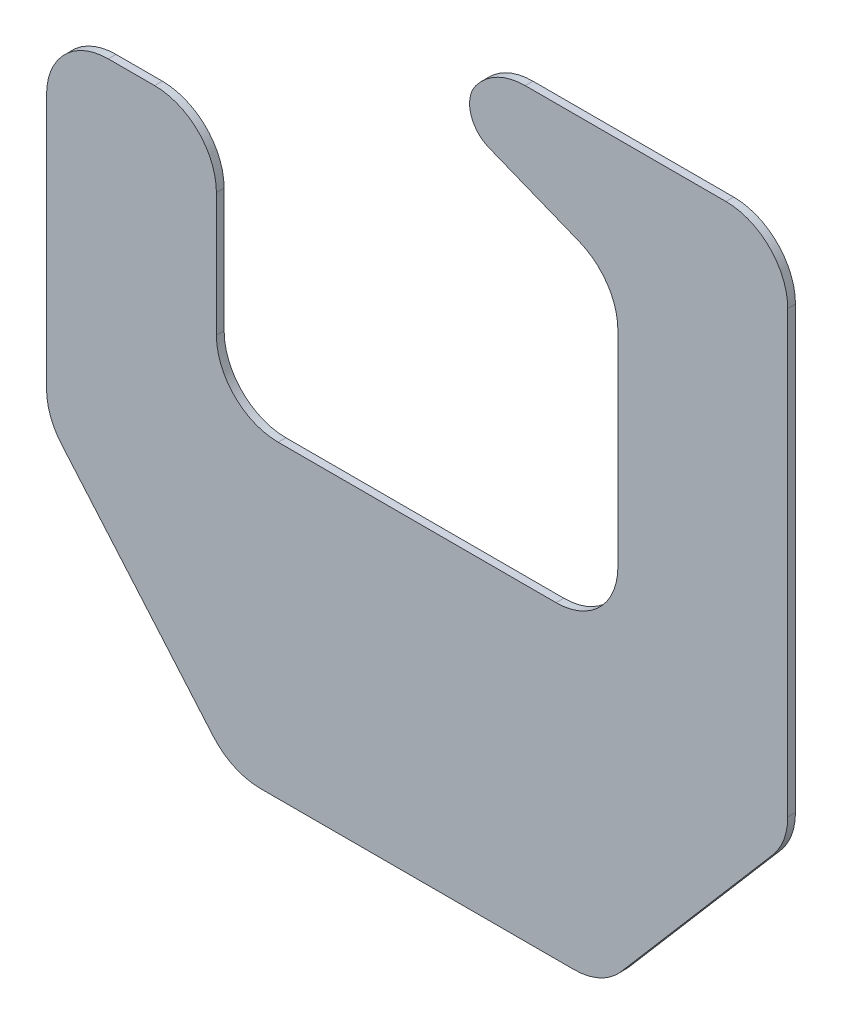
ISO-10303-21;
HEADER;
FILE_DESCRIPTION(('STEP AP214'),'2;1');
FILE_NAME('part.step','',(''),(''),'','','');
FILE_SCHEMA(('AUTOMOTIVE_DESIGN { 1 0 10303 214 1 1 1 1 }'));
ENDSEC;
DATA;
#1=APPLICATION_CONTEXT('core data for automotive mechanical design processes');
#2=APPLICATION_PROTOCOL_DEFINITION('international standard','automotive_design',2000,#1);
#3=PRODUCT_CONTEXT('',#1,'mechanical');
#4=PRODUCT('Part','Part','',(#3));
#5=PRODUCT_RELATED_PRODUCT_CATEGORY('part','',(#4));
#6=PRODUCT_DEFINITION_FORMATION('','',#4);
#7=PRODUCT_DEFINITION_CONTEXT('part definition',#1,'design');
#8=PRODUCT_DEFINITION('design','',#6,#7);
#9=PRODUCT_DEFINITION_SHAPE('','',#8);
#10=(LENGTH_UNIT() NAMED_UNIT(*) SI_UNIT(.MILLI.,.METRE.));
#11=(NAMED_UNIT(*) PLANE_ANGLE_UNIT() SI_UNIT($,.RADIAN.));
#12=(NAMED_UNIT(*) SI_UNIT($,.STERADIAN.) SOLID_ANGLE_UNIT());
#13=UNCERTAINTY_MEASURE_WITH_UNIT(LENGTH_MEASURE(1.E-05),#10,'distance_accuracy_value','');
#14=(GEOMETRIC_REPRESENTATION_CONTEXT(3) GLOBAL_UNCERTAINTY_ASSIGNED_CONTEXT((#13)) GLOBAL_UNIT_ASSIGNED_CONTEXT((#10,
#11,#12)) REPRESENTATION_CONTEXT('',''));
#15=CARTESIAN_POINT('',(0.,0.,0.));
#16=DIRECTION('',(0.,0.,1.));
#17=DIRECTION('',(1.,0.,0.));
#18=AXIS2_PLACEMENT_3D('',#15,#16,#17);
#19=CARTESIAN_POINT('',(0.,-129.032,64.516));
#20=DIRECTION('',(0.,0.,1.));
#21=DIRECTION('',(1.,0.,0.));
#22=AXIS2_PLACEMENT_3D('',#19,#20,#21);
#23=PLANE('',#22);
#24=DIRECTION('',(-0.650791373455968,-0.759256602365297,0.));
#25=VECTOR('',#24,1.);
#26=CARTESIAN_POINT('',(193.548,-516.128,64.516));
#27=LINE('',#26,#25);
#28=CARTESIAN_POINT('',(371.564198958199,-308.442434548767,64.516));
#29=VERTEX_POINT('',#28);
#30=CARTESIAN_POINT('',(212.859037500098,-493.598456249885,64.516));
#31=VERTEX_POINT('',#30);
#32=EDGE_CURVE('E172',#29,#31,#27,.T.);
#33=ORIENTED_EDGE('',*,*,#32,.T.);
#34=CARTESIAN_POINT('',(163.874838541899,-451.612,64.516));
#35=DIRECTION('',(0.,0.,1.));
#36=DIRECTION('',(1.,0.,0.));
#37=AXIS2_PLACEMENT_3D('',#34,#35,#36);
#38=CIRCLE('',#37,64.516);
#39=CARTESIAN_POINT('',(163.874838541899,-516.128,64.516));
#40=VERTEX_POINT('',#39);
#41=EDGE_CURVE('E186',#40,#31,#38,.T.);
#42=ORIENTED_EDGE('',*,*,#41,.F.);
#43=DIRECTION('',(1.,0.,0.));
#44=VECTOR('',#43,1.);
#45=CARTESIAN_POINT('',(-387.096,-516.128,64.516));
#46=LINE('',#45,#44);
#47=CARTESIAN_POINT('',(-163.874838541899,-516.128,64.516));
#48=VERTEX_POINT('',#47);
#49=EDGE_CURVE('E194',#48,#40,#46,.T.);
#50=ORIENTED_EDGE('',*,*,#49,.F.);
#51=CARTESIAN_POINT('',(-163.874838541899,-451.612,64.516));
#52=DIRECTION('',(0.,0.,-1.));
#53=DIRECTION('',(-1.,0.,0.));
#54=AXIS2_PLACEMENT_3D('',#51,#52,#53);
#55=CIRCLE('',#54,64.516);
#56=CARTESIAN_POINT('',(-212.859037500098,-493.598456249885,64.516));
#57=VERTEX_POINT('',#56);
#58=EDGE_CURVE('E274',#57,#48,#55,.F.);
#59=ORIENTED_EDGE('',*,*,#58,.F.);
#60=DIRECTION('',(-0.650791373455968,0.759256602365297,0.));
#61=VECTOR('',#60,1.);
#62=CARTESIAN_POINT('',(-387.096,-290.322,64.516));
#63=LINE('',#62,#61);
#64=CARTESIAN_POINT('',(-371.564198958199,-308.442434548767,64.516));
#65=VERTEX_POINT('',#64);
#66=EDGE_CURVE('E197',#57,#65,#63,.T.);
#67=ORIENTED_EDGE('',*,*,#66,.T.);
#68=CARTESIAN_POINT('',(-322.58,-266.455978298882,64.516));
#69=DIRECTION('',(0.,0.,1.));
#70=DIRECTION('',(1.,0.,0.));
#71=AXIS2_PLACEMENT_3D('',#68,#69,#70);
#72=CIRCLE('',#71,64.516);
#73=CARTESIAN_POINT('',(-387.096,-266.455978298882,64.516));
#74=VERTEX_POINT('',#73);
#75=EDGE_CURVE('E200',#74,#65,#72,.T.);
#76=ORIENTED_EDGE('',*,*,#75,.F.);
#77=DIRECTION('',(0.,1.,0.));
#78=VECTOR('',#77,1.);
#79=CARTESIAN_POINT('',(-387.096,258.064,64.516));
#80=LINE('',#79,#78);
#81=CARTESIAN_POINT('',(-387.096,-1.00630614952024E-13,64.516));
#82=VERTEX_POINT('',#81);
#83=EDGE_CURVE('E201',#82,#74,#80,.F.);
#84=ORIENTED_EDGE('',*,*,#83,.F.);
#85=CARTESIAN_POINT('',(-322.58,0.,64.516));
#86=DIRECTION('',(0.,0.,-1.));
#87=DIRECTION('',(-1.,0.,0.));
#88=AXIS2_PLACEMENT_3D('',#85,#86,#87);
#89=CIRCLE('',#88,64.516);
#90=CARTESIAN_POINT('',(-322.58,64.5159999999999,64.516));
#91=VERTEX_POINT('',#90);
#92=EDGE_CURVE('E279',#91,#82,#89,.F.);
#93=ORIENTED_EDGE('',*,*,#92,.F.);
#94=DIRECTION('',(1.,0.,0.));
#95=VECTOR('',#94,1.);
#96=CARTESIAN_POINT('',(-209.677,64.5159999999999,64.516));
#97=LINE('',#96,#95);
#98=CARTESIAN_POINT('',(-274.193,64.5159999999999,64.516));
#99=VERTEX_POINT('',#98);
#100=EDGE_CURVE('E205',#91,#99,#97,.T.);
#101=ORIENTED_EDGE('',*,*,#100,.T.);
#102=CARTESIAN_POINT('',(-274.193,0.,64.516));
#103=DIRECTION('',(0.,0.,-1.));
#104=DIRECTION('',(-1.,0.,0.));
#105=AXIS2_PLACEMENT_3D('',#102,#103,#104);
#106=CIRCLE('',#105,64.516);
#107=CARTESIAN_POINT('',(-209.677,0.,64.516));
#108=VERTEX_POINT('',#107);
#109=EDGE_CURVE('E282',#108,#99,#106,.F.);
#110=ORIENTED_EDGE('',*,*,#109,.F.);
#111=DIRECTION('',(0.,1.,0.));
#112=VECTOR('',#111,1.);
#113=CARTESIAN_POINT('',(-209.677,-193.548,64.516));
#114=LINE('',#113,#112);
#115=CARTESIAN_POINT('',(-209.677,-129.032,64.516));
#116=VERTEX_POINT('',#115);
#117=EDGE_CURVE('E209',#108,#116,#114,.F.);
#118=ORIENTED_EDGE('',*,*,#117,.T.);
#119=CARTESIAN_POINT('',(-145.161,-129.032,64.516));
#120=DIRECTION('',(0.,0.,-1.));
#121=DIRECTION('',(-1.,0.,0.));
#122=AXIS2_PLACEMENT_3D('',#119,#120,#121);
#123=CIRCLE('',#122,64.516);
#124=CARTESIAN_POINT('',(-145.161,-193.548,64.516));
#125=VERTEX_POINT('',#124);
#126=EDGE_CURVE('E212',#125,#116,#123,.T.);
#127=ORIENTED_EDGE('',*,*,#126,.F.);
#128=DIRECTION('',(1.,0.,0.));
#129=VECTOR('',#128,1.);
#130=CARTESIAN_POINT('',(209.677,-193.548,64.516));
#131=LINE('',#130,#129);
#132=CARTESIAN_POINT('',(145.161,-193.548,64.516));
#133=VERTEX_POINT('',#132);
#134=EDGE_CURVE('E213',#125,#133,#131,.T.);
#135=ORIENTED_EDGE('',*,*,#134,.T.);
#136=CARTESIAN_POINT('',(145.161,-129.032,64.516));
#137=DIRECTION('',(0.,0.,-1.));
#138=DIRECTION('',(-1.,0.,0.));
#139=AXIS2_PLACEMENT_3D('',#136,#137,#138);
#140=CIRCLE('',#139,64.516);
#141=CARTESIAN_POINT('',(209.677,-129.032,64.516));
#142=VERTEX_POINT('',#141);
#143=EDGE_CURVE('E216',#142,#133,#140,.T.);
#144=ORIENTED_EDGE('',*,*,#143,.F.);
#145=DIRECTION('',(0.,1.,0.));
#146=VECTOR('',#145,1.);
#147=CARTESIAN_POINT('',(209.677,129.032,64.516));
#148=LINE('',#147,#146);
#149=CARTESIAN_POINT('',(209.677,85.3525414605821,64.516));
#150=VERTEX_POINT('',#149);
#151=EDGE_CURVE('E217',#142,#150,#148,.T.);
#152=ORIENTED_EDGE('',*,*,#151,.T.);
#153=CARTESIAN_POINT('',(145.161,85.3525414605821,64.516));
#154=DIRECTION('',(0.,0.,-1.));
#155=DIRECTION('',(-1.,0.,0.));
#156=AXIS2_PLACEMENT_3D('',#153,#154,#155);
#157=CIRCLE('',#156,64.516);
#158=CARTESIAN_POINT('',(169.121640875661,145.254143649735,64.516));
#159=VERTEX_POINT('',#158);
#160=EDGE_CURVE('E220',#159,#150,#157,.T.);
#161=ORIENTED_EDGE('',*,*,#160,.F.);
#162=DIRECTION('',(-0.928476690885259,0.371390676354104,0.));
#163=VECTOR('',#162,1.);
#164=CARTESIAN_POINT('',(48.387,193.548,64.516));
#165=LINE('',#164,#163);
#166=CARTESIAN_POINT('',(75.061187964,182.8783248144,64.516));
#167=VERTEX_POINT('',#166);
#168=EDGE_CURVE('E221',#159,#167,#165,.T.);
#169=ORIENTED_EDGE('',*,*,#168,.T.);
#170=CARTESIAN_POINT('',(87.0415084018307,212.829125908977,64.516));
#171=DIRECTION('',(0.,0.,-1.));
#172=DIRECTION('',(-1.,0.,0.));
#173=AXIS2_PLACEMENT_3D('',#170,#171,#172);
#174=CIRCLE('',#173,32.258);
#175=CARTESIAN_POINT('',(61.1800168036613,232.110251817953,64.516));
#176=VERTEX_POINT('',#175);
#177=EDGE_CURVE('E294',#176,#167,#174,.F.);
#178=ORIENTED_EDGE('',*,*,#177,.F.);
#179=CARTESIAN_POINT('',(112.903,193.548,64.516));
#180=DIRECTION('',(0.,0.,1.));
#181=DIRECTION('',(1.,0.,0.));
#182=AXIS2_PLACEMENT_3D('',#179,#180,#181);
#183=CIRCLE('',#182,64.516);
#184=CARTESIAN_POINT('',(112.903,258.064,64.516));
#185=VERTEX_POINT('',#184);
#186=EDGE_CURVE('E297',#185,#176,#183,.T.);
#187=ORIENTED_EDGE('',*,*,#186,.F.);
#188=DIRECTION('',(1.,0.,0.));
#189=VECTOR('',#188,1.);
#190=CARTESIAN_POINT('',(387.096,258.064,64.516));
#191=LINE('',#190,#189);
#192=CARTESIAN_POINT('',(322.58,258.064,64.516));
#193=VERTEX_POINT('',#192);
#194=EDGE_CURVE('E225',#193,#185,#191,.F.);
#195=ORIENTED_EDGE('',*,*,#194,.F.);
#196=CARTESIAN_POINT('',(322.58,193.548,64.516));
#197=DIRECTION('',(0.,0.,1.));
#198=DIRECTION('',(1.,0.,0.));
#199=AXIS2_PLACEMENT_3D('',#196,#197,#198);
#200=CIRCLE('',#199,64.516);
#201=CARTESIAN_POINT('',(387.096,193.548,64.516));
#202=VERTEX_POINT('',#201);
#203=EDGE_CURVE('E299',#202,#193,#200,.T.);
#204=ORIENTED_EDGE('',*,*,#203,.F.);
#205=DIRECTION('',(0.,1.,0.));
#206=VECTOR('',#205,1.);
#207=CARTESIAN_POINT('',(387.096,-516.128,64.516));
#208=LINE('',#207,#206);
#209=CARTESIAN_POINT('',(387.096,-266.455978298882,64.516));
#210=VERTEX_POINT('',#209);
#211=EDGE_CURVE('E174',#210,#202,#208,.T.);
#212=ORIENTED_EDGE('',*,*,#211,.F.);
#213=CARTESIAN_POINT('',(322.58,-266.455978298882,64.516));
#214=DIRECTION('',(0.,0.,-1.));
#215=DIRECTION('',(-1.,0.,0.));
#216=AXIS2_PLACEMENT_3D('',#213,#214,#215);
#217=CIRCLE('',#216,64.516);
#218=EDGE_CURVE('E19',#29,#210,#217,.F.);
#219=ORIENTED_EDGE('',*,*,#218,.F.);
#220=EDGE_LOOP('',(#33,#42,#50,#59,#67,#76,#84,#93,#101,#110,#118,#127,#135,#144,#152,#161,#169,
#178,#187,#195,#204,#212,#219));
#221=FACE_BOUND('',#220,.T.);
#222=ADVANCED_FACE('F16',(#221),#23,.F.);
#223=CARTESIAN_POINT('',(322.58,-266.455978298882,68.54825));
#224=DIRECTION('',(0.,0.,-1.));
#225=DIRECTION('',(-1.,0.,0.));
#226=AXIS2_PLACEMENT_3D('',#223,#224,#225);
#227=CYLINDRICAL_SURFACE('',#226,64.516);
#228=CARTESIAN_POINT('',(322.58,-266.455978298882,72.5805));
#229=DIRECTION('',(0.,0.,-1.));
#230=DIRECTION('',(-1.,0.,0.));
#231=AXIS2_PLACEMENT_3D('',#228,#229,#230);
#232=CIRCLE('',#231,64.516);
#233=CARTESIAN_POINT('',(371.564198958199,-308.442434548767,72.5805));
#234=VERTEX_POINT('',#233);
#235=CARTESIAN_POINT('',(387.096,-266.455978298882,72.5805));
#236=VERTEX_POINT('',#235);
#237=EDGE_CURVE('E182',#234,#236,#232,.F.);
#238=ORIENTED_EDGE('',*,*,#237,.F.);
#239=DIRECTION('',(0.,0.,1.));
#240=VECTOR('',#239,1.);
#241=CARTESIAN_POINT('',(371.564198958199,-308.442434548767,72.5805));
#242=LINE('',#241,#240);
#243=EDGE_CURVE('E179',#234,#29,#242,.F.);
#244=ORIENTED_EDGE('',*,*,#243,.T.);
#245=ORIENTED_EDGE('',*,*,#218,.T.);
#246=DIRECTION('',(0.,0.,-1.));
#247=VECTOR('',#246,1.);
#248=CARTESIAN_POINT('',(387.096,-266.455978298882,64.516));
#249=LINE('',#248,#247);
#250=EDGE_CURVE('E177',#236,#210,#249,.T.);
#251=ORIENTED_EDGE('',*,*,#250,.F.);
#252=EDGE_LOOP('',(#238,#244,#245,#251));
#253=FACE_BOUND('',#252,.T.);
#254=ADVANCED_FACE('F180',(#253),#227,.T.);
#255=CARTESIAN_POINT('',(387.096,-516.128,64.516));
#256=DIRECTION('',(1.,0.,0.));
#257=DIRECTION('',(0.,0.,-1.));
#258=AXIS2_PLACEMENT_3D('',#255,#256,#257);
#259=PLANE('',#258);
#260=DIRECTION('',(0.,0.,1.));
#261=VECTOR('',#260,1.);
#262=CARTESIAN_POINT('',(387.096,193.548,64.516));
#263=LINE('',#262,#261);
#264=CARTESIAN_POINT('',(387.096,193.548,72.5805));
#265=VERTEX_POINT('',#264);
#266=EDGE_CURVE('E230',#265,#202,#263,.F.);
#267=ORIENTED_EDGE('',*,*,#266,.F.);
#268=DIRECTION('',(0.,1.,0.));
#269=VECTOR('',#268,1.);
#270=CARTESIAN_POINT('',(387.096,-129.032,72.5805));
#271=LINE('',#270,#269);
#272=EDGE_CURVE('E272',#236,#265,#271,.T.);
#273=ORIENTED_EDGE('',*,*,#272,.F.);
#274=ORIENTED_EDGE('',*,*,#250,.T.);
#275=ORIENTED_EDGE('',*,*,#211,.T.);
#276=EDGE_LOOP('',(#267,#273,#274,#275));
#277=FACE_BOUND('',#276,.T.);
#278=ADVANCED_FACE('F576',(#277),#259,.T.);
#279=CARTESIAN_POINT('',(322.58,193.548,64.516));
#280=DIRECTION('',(0.,0.,1.));
#281=DIRECTION('',(1.,0.,0.));
#282=AXIS2_PLACEMENT_3D('',#279,#280,#281);
#283=CYLINDRICAL_SURFACE('',#282,64.516);
#284=ORIENTED_EDGE('',*,*,#203,.T.);
#285=DIRECTION('',(0.,0.,1.));
#286=VECTOR('',#285,1.);
#287=CARTESIAN_POINT('',(322.58,258.064,64.516));
#288=LINE('',#287,#286);
#289=CARTESIAN_POINT('',(322.58,258.064,72.5805));
#290=VERTEX_POINT('',#289);
#291=EDGE_CURVE('E228',#290,#193,#288,.F.);
#292=ORIENTED_EDGE('',*,*,#291,.F.);
#293=CARTESIAN_POINT('',(322.58,193.548,72.5805));
#294=DIRECTION('',(0.,0.,1.));
#295=DIRECTION('',(1.,0.,0.));
#296=AXIS2_PLACEMENT_3D('',#293,#294,#295);
#297=CIRCLE('',#296,64.516);
#298=EDGE_CURVE('E269',#265,#290,#297,.T.);
#299=ORIENTED_EDGE('',*,*,#298,.F.);
#300=ORIENTED_EDGE('',*,*,#266,.T.);
#301=EDGE_LOOP('',(#284,#292,#299,#300));
#302=FACE_BOUND('',#301,.T.);
#303=ADVANCED_FACE('F566',(#302),#283,.T.);
#304=CARTESIAN_POINT('',(387.096,258.064,64.516));
#305=DIRECTION('',(0.,1.,0.));
#306=DIRECTION('',(0.,0.,1.));
#307=AXIS2_PLACEMENT_3D('',#304,#305,#306);
#308=PLANE('',#307);
#309=DIRECTION('',(0.,0.,1.));
#310=VECTOR('',#309,1.);
#311=CARTESIAN_POINT('',(112.903,258.064,68.54825));
#312=LINE('',#311,#310);
#313=CARTESIAN_POINT('',(112.903,258.064,72.5805));
#314=VERTEX_POINT('',#313);
#315=EDGE_CURVE('E227',#314,#185,#312,.F.);
#316=ORIENTED_EDGE('',*,*,#315,.F.);
#317=DIRECTION('',(1.,0.,0.));
#318=VECTOR('',#317,1.);
#319=CARTESIAN_POINT('',(0.,258.064,72.5805));
#320=LINE('',#319,#318);
#321=EDGE_CURVE('E268',#290,#314,#320,.F.);
#322=ORIENTED_EDGE('',*,*,#321,.F.);
#323=ORIENTED_EDGE('',*,*,#291,.T.);
#324=ORIENTED_EDGE('',*,*,#194,.T.);
#325=EDGE_LOOP('',(#316,#322,#323,#324));
#326=FACE_BOUND('',#325,.T.);
#327=ADVANCED_FACE('F556',(#326),#308,.T.);
#328=CARTESIAN_POINT('',(112.903,193.548,68.54825));
#329=DIRECTION('',(0.,0.,1.));
#330=DIRECTION('',(1.,0.,0.));
#331=AXIS2_PLACEMENT_3D('',#328,#329,#330);
#332=CYLINDRICAL_SURFACE('',#331,64.516);
#333=ORIENTED_EDGE('',*,*,#315,.T.);
#334=ORIENTED_EDGE('',*,*,#186,.T.);
#335=DIRECTION('',(0.,0.,-1.));
#336=VECTOR('',#335,1.);
#337=CARTESIAN_POINT('',(61.1800168036613,232.110251817953,68.54825));
#338=LINE('',#337,#336);
#339=CARTESIAN_POINT('',(61.1800168036613,232.110251817953,72.5805));
#340=VERTEX_POINT('',#339);
#341=EDGE_CURVE('E224',#340,#176,#338,.T.);
#342=ORIENTED_EDGE('',*,*,#341,.F.);
#343=CARTESIAN_POINT('',(112.903,193.548,72.5805));
#344=DIRECTION('',(0.,0.,1.));
#345=DIRECTION('',(1.,0.,0.));
#346=AXIS2_PLACEMENT_3D('',#343,#344,#345);
#347=CIRCLE('',#346,64.516);
#348=EDGE_CURVE('E265',#314,#340,#347,.T.);
#349=ORIENTED_EDGE('',*,*,#348,.F.);
#350=EDGE_LOOP('',(#333,#334,#342,#349));
#351=FACE_BOUND('',#350,.T.);
#352=ADVANCED_FACE('F546',(#351),#332,.T.);
#353=CARTESIAN_POINT('',(87.0415084018307,212.829125908977,68.54825));
#354=DIRECTION('',(0.,0.,-1.));
#355=DIRECTION('',(-1.,0.,0.));
#356=AXIS2_PLACEMENT_3D('',#353,#354,#355);
#357=CYLINDRICAL_SURFACE('',#356,32.258);
#358=CARTESIAN_POINT('',(87.0415084018307,212.829125908977,72.5805));
#359=DIRECTION('',(0.,0.,-1.));
#360=DIRECTION('',(-1.,0.,0.));
#361=AXIS2_PLACEMENT_3D('',#358,#359,#360);
#362=CIRCLE('',#361,32.258);
#363=CARTESIAN_POINT('',(75.061187964,182.8783248144,72.5805));
#364=VERTEX_POINT('',#363);
#365=EDGE_CURVE('E262',#340,#364,#362,.F.);
#366=ORIENTED_EDGE('',*,*,#365,.F.);
#367=ORIENTED_EDGE('',*,*,#341,.T.);
#368=ORIENTED_EDGE('',*,*,#177,.T.);
#369=DIRECTION('',(0.,0.,1.));
#370=VECTOR('',#369,1.);
#371=CARTESIAN_POINT('',(75.061187964,182.8783248144,72.5805));
#372=LINE('',#371,#370);
#373=EDGE_CURVE('E223',#167,#364,#372,.T.);
#374=ORIENTED_EDGE('',*,*,#373,.T.);
#375=EDGE_LOOP('',(#366,#367,#368,#374));
#376=FACE_BOUND('',#375,.T.);
#377=ADVANCED_FACE('F536',(#376),#357,.T.);
#378=CARTESIAN_POINT('',(48.387,193.548,72.5805));
#379=DIRECTION('',(0.371390676354104,0.928476690885259,0.));
#380=DIRECTION('',(-0.928476690885259,0.371390676354104,0.));
#381=AXIS2_PLACEMENT_3D('',#378,#379,#380);
#382=PLANE('',#381);
#383=DIRECTION('',(0.928476690885259,-0.371390676354104,0.));
#384=VECTOR('',#383,1.);
#385=CARTESIAN_POINT('',(75.061187964,182.8783248144,72.5805));
#386=LINE('',#385,#384);
#387=CARTESIAN_POINT('',(169.121640875661,145.254143649735,72.5805));
#388=VERTEX_POINT('',#387);
#389=EDGE_CURVE('E261',#364,#388,#386,.T.);
#390=ORIENTED_EDGE('',*,*,#389,.F.);
#391=ORIENTED_EDGE('',*,*,#373,.F.);
#392=ORIENTED_EDGE('',*,*,#168,.F.);
#393=DIRECTION('',(0.,0.,-1.));
#394=VECTOR('',#393,1.);
#395=CARTESIAN_POINT('',(169.121640875661,145.254143649735,72.5805));
#396=LINE('',#395,#394);
#397=EDGE_CURVE('E293',#388,#159,#396,.T.);
#398=ORIENTED_EDGE('',*,*,#397,.F.);
#399=EDGE_LOOP('',(#390,#391,#392,#398));
#400=FACE_BOUND('',#399,.T.);
#401=ADVANCED_FACE('F526',(#400),#382,.F.);
#402=CARTESIAN_POINT('',(145.161,85.3525414605821,72.5805));
#403=DIRECTION('',(0.,0.,-1.));
#404=DIRECTION('',(-1.,0.,0.));
#405=AXIS2_PLACEMENT_3D('',#402,#403,#404);
#406=CYLINDRICAL_SURFACE('',#405,64.516);
#407=ORIENTED_EDGE('',*,*,#160,.T.);
#408=DIRECTION('',(0.,0.,-1.));
#409=VECTOR('',#408,1.);
#410=CARTESIAN_POINT('',(209.677,85.3525414605821,72.5805));
#411=LINE('',#410,#409);
#412=CARTESIAN_POINT('',(209.677,85.3525414605821,72.5805));
#413=VERTEX_POINT('',#412);
#414=EDGE_CURVE('E219',#150,#413,#411,.F.);
#415=ORIENTED_EDGE('',*,*,#414,.T.);
#416=CARTESIAN_POINT('',(145.161,85.3525414605821,72.5805));
#417=DIRECTION('',(0.,0.,-1.));
#418=DIRECTION('',(-1.,0.,0.));
#419=AXIS2_PLACEMENT_3D('',#416,#417,#418);
#420=CIRCLE('',#419,64.516);
#421=EDGE_CURVE('E258',#388,#413,#420,.T.);
#422=ORIENTED_EDGE('',*,*,#421,.F.);
#423=ORIENTED_EDGE('',*,*,#397,.T.);
#424=EDGE_LOOP('',(#407,#415,#422,#423));
#425=FACE_BOUND('',#424,.T.);
#426=ADVANCED_FACE('F516',(#425),#406,.F.);
#427=CARTESIAN_POINT('',(209.677,129.032,72.5805));
#428=DIRECTION('',(1.,0.,0.));
#429=DIRECTION('',(0.,0.,-1.));
#430=AXIS2_PLACEMENT_3D('',#427,#428,#429);
#431=PLANE('',#430);
#432=ORIENTED_EDGE('',*,*,#151,.F.);
#433=DIRECTION('',(0.,0.,-1.));
#434=VECTOR('',#433,1.);
#435=CARTESIAN_POINT('',(209.677,-129.032,72.5805));
#436=LINE('',#435,#434);
#437=CARTESIAN_POINT('',(209.677,-129.032,72.5805));
#438=VERTEX_POINT('',#437);
#439=EDGE_CURVE('E290',#438,#142,#436,.T.);
#440=ORIENTED_EDGE('',*,*,#439,.F.);
#441=DIRECTION('',(0.,1.,0.));
#442=VECTOR('',#441,1.);
#443=CARTESIAN_POINT('',(209.677,-129.032,72.5805));
#444=LINE('',#443,#442);
#445=EDGE_CURVE('E257',#413,#438,#444,.F.);
#446=ORIENTED_EDGE('',*,*,#445,.F.);
#447=ORIENTED_EDGE('',*,*,#414,.F.);
#448=EDGE_LOOP('',(#432,#440,#446,#447));
#449=FACE_BOUND('',#448,.T.);
#450=ADVANCED_FACE('F506',(#449),#431,.F.);
#451=CARTESIAN_POINT('',(145.161,-129.032,72.5805));
#452=DIRECTION('',(0.,0.,-1.));
#453=DIRECTION('',(-1.,0.,0.));
#454=AXIS2_PLACEMENT_3D('',#451,#452,#453);
#455=CYLINDRICAL_SURFACE('',#454,64.516);
#456=ORIENTED_EDGE('',*,*,#143,.T.);
#457=DIRECTION('',(0.,0.,-1.));
#458=VECTOR('',#457,1.);
#459=CARTESIAN_POINT('',(145.161,-193.548,72.5805));
#460=LINE('',#459,#458);
#461=CARTESIAN_POINT('',(145.161,-193.548,72.5805));
#462=VERTEX_POINT('',#461);
#463=EDGE_CURVE('E215',#133,#462,#460,.F.);
#464=ORIENTED_EDGE('',*,*,#463,.T.);
#465=CARTESIAN_POINT('',(145.161,-129.032,72.5805));
#466=DIRECTION('',(0.,0.,-1.));
#467=DIRECTION('',(-1.,0.,0.));
#468=AXIS2_PLACEMENT_3D('',#465,#466,#467);
#469=CIRCLE('',#468,64.516);
#470=EDGE_CURVE('E254',#438,#462,#469,.T.);
#471=ORIENTED_EDGE('',*,*,#470,.F.);
#472=ORIENTED_EDGE('',*,*,#439,.T.);
#473=EDGE_LOOP('',(#456,#464,#471,#472));
#474=FACE_BOUND('',#473,.T.);
#475=ADVANCED_FACE('F496',(#474),#455,.F.);
#476=CARTESIAN_POINT('',(209.677,-193.548,72.5805));
#477=DIRECTION('',(0.,-1.,0.));
#478=DIRECTION('',(0.,0.,-1.));
#479=AXIS2_PLACEMENT_3D('',#476,#477,#478);
#480=PLANE('',#479);
#481=DIRECTION('',(1.,0.,0.));
#482=VECTOR('',#481,1.);
#483=CARTESIAN_POINT('',(0.,-193.548,72.5805));
#484=LINE('',#483,#482);
#485=CARTESIAN_POINT('',(-145.161,-193.548,72.5805));
#486=VERTEX_POINT('',#485);
#487=EDGE_CURVE('E253',#462,#486,#484,.F.);
#488=ORIENTED_EDGE('',*,*,#487,.F.);
#489=ORIENTED_EDGE('',*,*,#463,.F.);
#490=ORIENTED_EDGE('',*,*,#134,.F.);
#491=DIRECTION('',(0.,0.,-1.));
#492=VECTOR('',#491,1.);
#493=CARTESIAN_POINT('',(-145.161,-193.548,72.5805));
#494=LINE('',#493,#492);
#495=EDGE_CURVE('E287',#486,#125,#494,.T.);
#496=ORIENTED_EDGE('',*,*,#495,.F.);
#497=EDGE_LOOP('',(#488,#489,#490,#496));
#498=FACE_BOUND('',#497,.T.);
#499=ADVANCED_FACE('F486',(#498),#480,.F.);
#500=CARTESIAN_POINT('',(-145.161,-129.032,72.5805));
#501=DIRECTION('',(0.,0.,-1.));
#502=DIRECTION('',(-1.,0.,0.));
#503=AXIS2_PLACEMENT_3D('',#500,#501,#502);
#504=CYLINDRICAL_SURFACE('',#503,64.516);
#505=ORIENTED_EDGE('',*,*,#126,.T.);
#506=DIRECTION('',(0.,0.,1.));
#507=VECTOR('',#506,1.);
#508=CARTESIAN_POINT('',(-209.677,-129.032,72.5805));
#509=LINE('',#508,#507);
#510=CARTESIAN_POINT('',(-209.677,-129.032,72.5805));
#511=VERTEX_POINT('',#510);
#512=EDGE_CURVE('E211',#116,#511,#509,.T.);
#513=ORIENTED_EDGE('',*,*,#512,.T.);
#514=CARTESIAN_POINT('',(-145.161,-129.032,72.5805));
#515=DIRECTION('',(0.,0.,-1.));
#516=DIRECTION('',(-1.,0.,0.));
#517=AXIS2_PLACEMENT_3D('',#514,#515,#516);
#518=CIRCLE('',#517,64.516);
#519=EDGE_CURVE('E250',#486,#511,#518,.T.);
#520=ORIENTED_EDGE('',*,*,#519,.F.);
#521=ORIENTED_EDGE('',*,*,#495,.T.);
#522=EDGE_LOOP('',(#505,#513,#520,#521));
#523=FACE_BOUND('',#522,.T.);
#524=ADVANCED_FACE('F476',(#523),#504,.F.);
#525=CARTESIAN_POINT('',(-209.677,-193.548,72.5805));
#526=DIRECTION('',(-1.,0.,0.));
#527=DIRECTION('',(0.,0.,1.));
#528=AXIS2_PLACEMENT_3D('',#525,#526,#527);
#529=PLANE('',#528);
#530=DIRECTION('',(0.,1.,0.));
#531=VECTOR('',#530,1.);
#532=CARTESIAN_POINT('',(-209.677,-129.032,72.5805));
#533=LINE('',#532,#531);
#534=CARTESIAN_POINT('',(-209.677,0.,72.5805));
#535=VERTEX_POINT('',#534);
#536=EDGE_CURVE('E249',#511,#535,#533,.T.);
#537=ORIENTED_EDGE('',*,*,#536,.F.);
#538=ORIENTED_EDGE('',*,*,#512,.F.);
#539=ORIENTED_EDGE('',*,*,#117,.F.);
#540=DIRECTION('',(0.,0.,-1.));
#541=VECTOR('',#540,1.);
#542=CARTESIAN_POINT('',(-209.677,0.,72.5805));
#543=LINE('',#542,#541);
#544=EDGE_CURVE('E208',#535,#108,#543,.T.);
#545=ORIENTED_EDGE('',*,*,#544,.F.);
#546=EDGE_LOOP('',(#537,#538,#539,#545));
#547=FACE_BOUND('',#546,.T.);
#548=ADVANCED_FACE('F466',(#547),#529,.F.);
#549=CARTESIAN_POINT('',(-274.193,0.,72.5805));
#550=DIRECTION('',(0.,0.,-1.));
#551=DIRECTION('',(-1.,0.,0.));
#552=AXIS2_PLACEMENT_3D('',#549,#550,#551);
#553=CYLINDRICAL_SURFACE('',#552,64.516);
#554=CARTESIAN_POINT('',(-274.193,0.,72.5805));
#555=DIRECTION('',(0.,0.,-1.));
#556=DIRECTION('',(-1.,0.,0.));
#557=AXIS2_PLACEMENT_3D('',#554,#555,#556);
#558=CIRCLE('',#557,64.516);
#559=CARTESIAN_POINT('',(-274.193,64.5159999999999,72.5805));
#560=VERTEX_POINT('',#559);
#561=EDGE_CURVE('E246',#535,#560,#558,.F.);
#562=ORIENTED_EDGE('',*,*,#561,.F.);
#563=ORIENTED_EDGE('',*,*,#544,.T.);
#564=ORIENTED_EDGE('',*,*,#109,.T.);
#565=DIRECTION('',(0.,0.,-1.));
#566=VECTOR('',#565,1.);
#567=CARTESIAN_POINT('',(-274.193,64.5159999999999,72.5805));
#568=LINE('',#567,#566);
#569=EDGE_CURVE('E207',#99,#560,#568,.F.);
#570=ORIENTED_EDGE('',*,*,#569,.T.);
#571=EDGE_LOOP('',(#562,#563,#564,#570));
#572=FACE_BOUND('',#571,.T.);
#573=ADVANCED_FACE('F456',(#572),#553,.T.);
#574=CARTESIAN_POINT('',(-209.677,64.5159999999999,72.5805));
#575=DIRECTION('',(0.,-1.,0.));
#576=DIRECTION('',(0.,0.,-1.));
#577=AXIS2_PLACEMENT_3D('',#574,#575,#576);
#578=PLANE('',#577);
#579=DIRECTION('',(1.,0.,0.));
#580=VECTOR('',#579,1.);
#581=CARTESIAN_POINT('',(0.,64.5159999999999,72.5805));
#582=LINE('',#581,#580);
#583=CARTESIAN_POINT('',(-322.58,64.5159999999999,72.5805));
#584=VERTEX_POINT('',#583);
#585=EDGE_CURVE('E245',#560,#584,#582,.F.);
#586=ORIENTED_EDGE('',*,*,#585,.F.);
#587=ORIENTED_EDGE('',*,*,#569,.F.);
#588=ORIENTED_EDGE('',*,*,#100,.F.);
#589=DIRECTION('',(0.,0.,-1.));
#590=VECTOR('',#589,1.);
#591=CARTESIAN_POINT('',(-322.58,64.5159999999999,68.54825));
#592=LINE('',#591,#590);
#593=EDGE_CURVE('E281',#584,#91,#592,.T.);
#594=ORIENTED_EDGE('',*,*,#593,.F.);
#595=EDGE_LOOP('',(#586,#587,#588,#594));
#596=FACE_BOUND('',#595,.T.);
#597=ADVANCED_FACE('F446',(#596),#578,.F.);
#598=CARTESIAN_POINT('',(-322.58,0.,68.54825));
#599=DIRECTION('',(0.,0.,-1.));
#600=DIRECTION('',(-1.,0.,0.));
#601=AXIS2_PLACEMENT_3D('',#598,#599,#600);
#602=CYLINDRICAL_SURFACE('',#601,64.516);
#603=CARTESIAN_POINT('',(-322.58,0.,72.5805));
#604=DIRECTION('',(0.,0.,-1.));
#605=DIRECTION('',(-1.,0.,0.));
#606=AXIS2_PLACEMENT_3D('',#603,#604,#605);
#607=CIRCLE('',#606,64.516);
#608=CARTESIAN_POINT('',(-387.096,-1.00630614952024E-13,72.5805));
#609=VERTEX_POINT('',#608);
#610=EDGE_CURVE('E242',#584,#609,#607,.F.);
#611=ORIENTED_EDGE('',*,*,#610,.F.);
#612=ORIENTED_EDGE('',*,*,#593,.T.);
#613=ORIENTED_EDGE('',*,*,#92,.T.);
#614=DIRECTION('',(0.,0.,1.));
#615=VECTOR('',#614,1.);
#616=CARTESIAN_POINT('',(-387.096,-1.11022302462516E-13,64.516));
#617=LINE('',#616,#615);
#618=EDGE_CURVE('E204',#609,#82,#617,.F.);
#619=ORIENTED_EDGE('',*,*,#618,.F.);
#620=EDGE_LOOP('',(#611,#612,#613,#619));
#621=FACE_BOUND('',#620,.T.);
#622=ADVANCED_FACE('F436',(#621),#602,.T.);
#623=CARTESIAN_POINT('',(-387.096,258.064,64.516));
#624=DIRECTION('',(-1.,0.,0.));
#625=DIRECTION('',(0.,0.,1.));
#626=AXIS2_PLACEMENT_3D('',#623,#624,#625);
#627=PLANE('',#626);
#628=ORIENTED_EDGE('',*,*,#618,.T.);
#629=ORIENTED_EDGE('',*,*,#83,.T.);
#630=DIRECTION('',(0.,0.,1.));
#631=VECTOR('',#630,1.);
#632=CARTESIAN_POINT('',(-387.096,-266.455978298882,68.54825));
#633=LINE('',#632,#631);
#634=CARTESIAN_POINT('',(-387.096,-266.455978298882,72.5805));
#635=VERTEX_POINT('',#634);
#636=EDGE_CURVE('E203',#635,#74,#633,.F.);
#637=ORIENTED_EDGE('',*,*,#636,.F.);
#638=DIRECTION('',(0.,1.,0.));
#639=VECTOR('',#638,1.);
#640=CARTESIAN_POINT('',(-387.096,-129.032,72.5805));
#641=LINE('',#640,#639);
#642=EDGE_CURVE('E241',#609,#635,#641,.F.);
#643=ORIENTED_EDGE('',*,*,#642,.F.);
#644=EDGE_LOOP('',(#628,#629,#637,#643));
#645=FACE_BOUND('',#644,.T.);
#646=ADVANCED_FACE('F426',(#645),#627,.T.);
#647=CARTESIAN_POINT('',(-322.58,-266.455978298882,68.54825));
#648=DIRECTION('',(0.,0.,1.));
#649=DIRECTION('',(1.,0.,0.));
#650=AXIS2_PLACEMENT_3D('',#647,#648,#649);
#651=CYLINDRICAL_SURFACE('',#650,64.516);
#652=ORIENTED_EDGE('',*,*,#75,.T.);
#653=DIRECTION('',(0.,0.,1.));
#654=VECTOR('',#653,1.);
#655=CARTESIAN_POINT('',(-371.564198958199,-308.442434548767,72.5805));
#656=LINE('',#655,#654);
#657=CARTESIAN_POINT('',(-371.564198958199,-308.442434548767,72.5805));
#658=VERTEX_POINT('',#657);
#659=EDGE_CURVE('E199',#65,#658,#656,.T.);
#660=ORIENTED_EDGE('',*,*,#659,.T.);
#661=CARTESIAN_POINT('',(-322.58,-266.455978298882,72.5805));
#662=DIRECTION('',(0.,0.,1.));
#663=DIRECTION('',(1.,0.,0.));
#664=AXIS2_PLACEMENT_3D('',#661,#662,#663);
#665=CIRCLE('',#664,64.516);
#666=EDGE_CURVE('E238',#635,#658,#665,.T.);
#667=ORIENTED_EDGE('',*,*,#666,.F.);
#668=ORIENTED_EDGE('',*,*,#636,.T.);
#669=EDGE_LOOP('',(#652,#660,#667,#668));
#670=FACE_BOUND('',#669,.T.);
#671=ADVANCED_FACE('F416',(#670),#651,.T.);
#672=CARTESIAN_POINT('',(-387.096,-290.322,72.5805));
#673=DIRECTION('',(0.759256602365297,0.650791373455968,0.));
#674=DIRECTION('',(-0.650791373455968,0.759256602365297,0.));
#675=AXIS2_PLACEMENT_3D('',#672,#673,#674);
#676=PLANE('',#675);
#677=DIRECTION('',(0.650791373455968,-0.759256602365297,0.));
#678=VECTOR('',#677,1.);
#679=CARTESIAN_POINT('',(-371.564198958199,-308.442434548767,72.5805));
#680=LINE('',#679,#678);
#681=CARTESIAN_POINT('',(-212.859037500098,-493.598456249885,72.5805));
#682=VERTEX_POINT('',#681);
#683=EDGE_CURVE('E237',#658,#682,#680,.T.);
#684=ORIENTED_EDGE('',*,*,#683,.F.);
#685=ORIENTED_EDGE('',*,*,#659,.F.);
#686=ORIENTED_EDGE('',*,*,#66,.F.);
#687=DIRECTION('',(0.,0.,-1.));
#688=VECTOR('',#687,1.);
#689=CARTESIAN_POINT('',(-212.859037500098,-493.598456249885,68.54825));
#690=LINE('',#689,#688);
#691=EDGE_CURVE('E276',#682,#57,#690,.T.);
#692=ORIENTED_EDGE('',*,*,#691,.F.);
#693=EDGE_LOOP('',(#684,#685,#686,#692));
#694=FACE_BOUND('',#693,.T.);
#695=ADVANCED_FACE('F406',(#694),#676,.F.);
#696=CARTESIAN_POINT('',(-163.874838541899,-451.612,68.54825));
#697=DIRECTION('',(0.,0.,-1.));
#698=DIRECTION('',(-1.,0.,0.));
#699=AXIS2_PLACEMENT_3D('',#696,#697,#698);
#700=CYLINDRICAL_SURFACE('',#699,64.516);
#701=CARTESIAN_POINT('',(-163.874838541899,-451.612,72.5805));
#702=DIRECTION('',(0.,0.,-1.));
#703=DIRECTION('',(-1.,0.,0.));
#704=AXIS2_PLACEMENT_3D('',#701,#702,#703);
#705=CIRCLE('',#704,64.516);
#706=CARTESIAN_POINT('',(-163.874838541899,-516.128,72.5805));
#707=VERTEX_POINT('',#706);
#708=EDGE_CURVE('E234',#682,#707,#705,.F.);
#709=ORIENTED_EDGE('',*,*,#708,.F.);
#710=ORIENTED_EDGE('',*,*,#691,.T.);
#711=ORIENTED_EDGE('',*,*,#58,.T.);
#712=DIRECTION('',(0.,0.,-1.));
#713=VECTOR('',#712,1.);
#714=CARTESIAN_POINT('',(-163.874838541899,-516.128,64.516));
#715=LINE('',#714,#713);
#716=EDGE_CURVE('E196',#707,#48,#715,.T.);
#717=ORIENTED_EDGE('',*,*,#716,.F.);
#718=EDGE_LOOP('',(#709,#710,#711,#717));
#719=FACE_BOUND('',#718,.T.);
#720=ADVANCED_FACE('F372',(#719),#700,.T.);
#721=CARTESIAN_POINT('',(-387.096,-516.128,64.516));
#722=DIRECTION('',(0.,-1.,0.));
#723=DIRECTION('',(0.,0.,-1.));
#724=AXIS2_PLACEMENT_3D('',#721,#722,#723);
#725=PLANE('',#724);
#726=ORIENTED_EDGE('',*,*,#716,.T.);
#727=ORIENTED_EDGE('',*,*,#49,.T.);
#728=DIRECTION('',(0.,0.,1.));
#729=VECTOR('',#728,1.);
#730=CARTESIAN_POINT('',(163.874838541899,-516.128,68.54825));
#731=LINE('',#730,#729);
#732=CARTESIAN_POINT('',(163.874838541899,-516.128,72.5805));
#733=VERTEX_POINT('',#732);
#734=EDGE_CURVE('E189',#733,#40,#731,.F.);
#735=ORIENTED_EDGE('',*,*,#734,.F.);
#736=DIRECTION('',(1.,0.,0.));
#737=VECTOR('',#736,1.);
#738=CARTESIAN_POINT('',(0.,-516.128,72.5805));
#739=LINE('',#738,#737);
#740=EDGE_CURVE('E233',#707,#733,#739,.T.);
#741=ORIENTED_EDGE('',*,*,#740,.F.);
#742=EDGE_LOOP('',(#726,#727,#735,#741));
#743=FACE_BOUND('',#742,.T.);
#744=ADVANCED_FACE('F361',(#743),#725,.T.);
#745=CARTESIAN_POINT('',(163.874838541899,-451.612,68.54825));
#746=DIRECTION('',(0.,0.,1.));
#747=DIRECTION('',(1.,0.,0.));
#748=AXIS2_PLACEMENT_3D('',#745,#746,#747);
#749=CYLINDRICAL_SURFACE('',#748,64.516);
#750=ORIENTED_EDGE('',*,*,#41,.T.);
#751=DIRECTION('',(0.,0.,1.));
#752=VECTOR('',#751,1.);
#753=CARTESIAN_POINT('',(212.859037500098,-493.598456249885,72.5805));
#754=LINE('',#753,#752);
#755=CARTESIAN_POINT('',(212.859037500098,-493.598456249885,72.5805));
#756=VERTEX_POINT('',#755);
#757=EDGE_CURVE('E34',#31,#756,#754,.T.);
#758=ORIENTED_EDGE('',*,*,#757,.T.);
#759=CARTESIAN_POINT('',(163.874838541899,-451.612,72.5805));
#760=DIRECTION('',(0.,0.,1.));
#761=DIRECTION('',(1.,0.,0.));
#762=AXIS2_PLACEMENT_3D('',#759,#760,#761);
#763=CIRCLE('',#762,64.516);
#764=EDGE_CURVE('E25',#733,#756,#763,.T.);
#765=ORIENTED_EDGE('',*,*,#764,.F.);
#766=ORIENTED_EDGE('',*,*,#734,.T.);
#767=EDGE_LOOP('',(#750,#758,#765,#766));
#768=FACE_BOUND('',#767,.T.);
#769=ADVANCED_FACE('F363',(#768),#749,.T.);
#770=CARTESIAN_POINT('',(193.548,-516.128,72.5805));
#771=DIRECTION('',(-0.759256602365297,0.650791373455968,0.));
#772=DIRECTION('',(-0.650791373455968,-0.759256602365297,0.));
#773=AXIS2_PLACEMENT_3D('',#770,#771,#772);
#774=PLANE('',#773);
#775=DIRECTION('',(0.650791373455968,0.759256602365297,0.));
#776=VECTOR('',#775,1.);
#777=CARTESIAN_POINT('',(212.859037500098,-493.598456249885,72.5805));
#778=LINE('',#777,#776);
#779=EDGE_CURVE('E10',#756,#234,#778,.T.);
#780=ORIENTED_EDGE('',*,*,#779,.F.);
#781=ORIENTED_EDGE('',*,*,#757,.F.);
#782=ORIENTED_EDGE('',*,*,#32,.F.);
#783=ORIENTED_EDGE('',*,*,#243,.F.);
#784=EDGE_LOOP('',(#780,#781,#782,#783));
#785=FACE_BOUND('',#784,.T.);
#786=ADVANCED_FACE('F185',(#785),#774,.F.);
#787=CARTESIAN_POINT('',(0.,-129.032,72.5805));
#788=DIRECTION('',(0.,0.,1.));
#789=DIRECTION('',(1.,0.,0.));
#790=AXIS2_PLACEMENT_3D('',#787,#788,#789);
#791=PLANE('',#790);
#792=ORIENTED_EDGE('',*,*,#764,.T.);
#793=ORIENTED_EDGE('',*,*,#779,.T.);
#794=ORIENTED_EDGE('',*,*,#237,.T.);
#795=ORIENTED_EDGE('',*,*,#272,.T.);
#796=ORIENTED_EDGE('',*,*,#298,.T.);
#797=ORIENTED_EDGE('',*,*,#321,.T.);
#798=ORIENTED_EDGE('',*,*,#348,.T.);
#799=ORIENTED_EDGE('',*,*,#365,.T.);
#800=ORIENTED_EDGE('',*,*,#389,.T.);
#801=ORIENTED_EDGE('',*,*,#421,.T.);
#802=ORIENTED_EDGE('',*,*,#445,.T.);
#803=ORIENTED_EDGE('',*,*,#470,.T.);
#804=ORIENTED_EDGE('',*,*,#487,.T.);
#805=ORIENTED_EDGE('',*,*,#519,.T.);
#806=ORIENTED_EDGE('',*,*,#536,.T.);
#807=ORIENTED_EDGE('',*,*,#561,.T.);
#808=ORIENTED_EDGE('',*,*,#585,.T.);
#809=ORIENTED_EDGE('',*,*,#610,.T.);
#810=ORIENTED_EDGE('',*,*,#642,.T.);
#811=ORIENTED_EDGE('',*,*,#666,.T.);
#812=ORIENTED_EDGE('',*,*,#683,.T.);
#813=ORIENTED_EDGE('',*,*,#708,.T.);
#814=ORIENTED_EDGE('',*,*,#740,.T.);
#815=EDGE_LOOP('',(#792,#793,#794,#795,#796,#797,#798,#799,#800,#801,#802,#803,#804,#805,#806,
#807,#808,#809,#810,#811,#812,#813,#814));
#816=FACE_BOUND('',#815,.T.);
#817=ADVANCED_FACE('F358',(#816),#791,.T.);
#818=CLOSED_SHELL('',(#222,#254,#278,#303,#327,#352,#377,#401,#426,#450,#475,#499,#524,#548,
#573,#597,#622,#646,#671,#695,#720,#744,#769,#786,#817));
#819=MANIFOLD_SOLID_BREP('B1',#818);
#820=ADVANCED_BREP_SHAPE_REPRESENTATION('',(#18,#819),#14);
#821=SHAPE_DEFINITION_REPRESENTATION(#9,#820);
ENDSEC;
END-ISO-10303-21;
